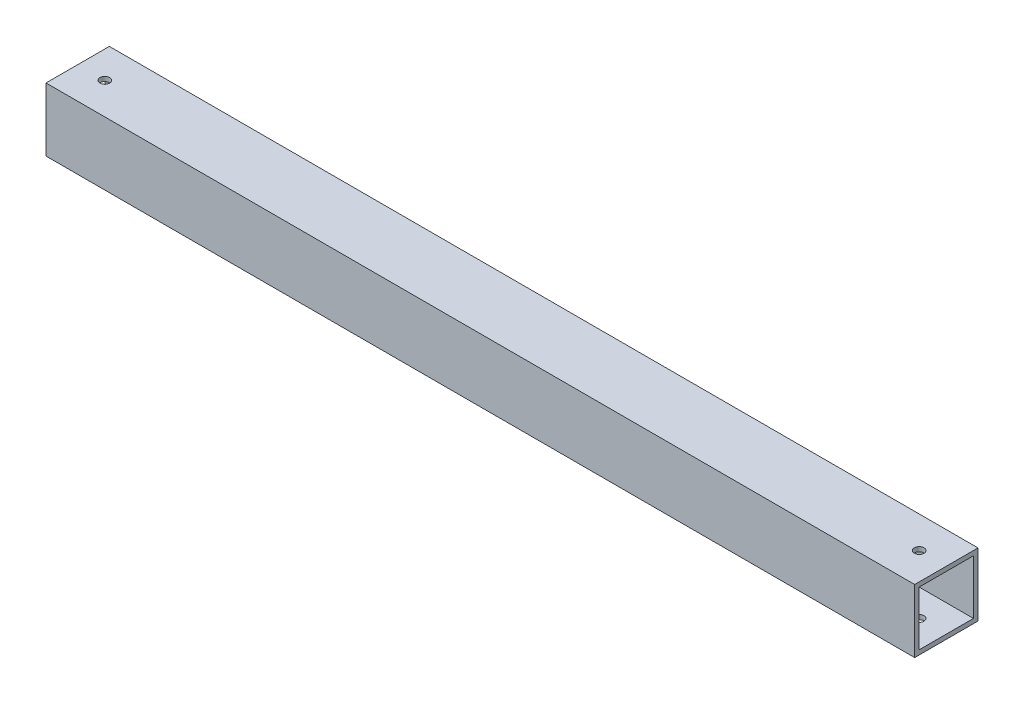
ISO-10303-21;
HEADER;
FILE_DESCRIPTION(('STEP AP214'),'2;1');
FILE_NAME('part.step','',(''),(''),'','','');
FILE_SCHEMA(('AUTOMOTIVE_DESIGN { 1 0 10303 214 1 1 1 1 }'));
ENDSEC;
DATA;
#1=APPLICATION_CONTEXT('core data for automotive mechanical design processes');
#2=APPLICATION_PROTOCOL_DEFINITION('international standard','automotive_design',2000,#1);
#3=PRODUCT_CONTEXT('',#1,'mechanical');
#4=PRODUCT('Part','Part','',(#3));
#5=PRODUCT_RELATED_PRODUCT_CATEGORY('part','',(#4));
#6=PRODUCT_DEFINITION_FORMATION('','',#4);
#7=PRODUCT_DEFINITION_CONTEXT('part definition',#1,'design');
#8=PRODUCT_DEFINITION('design','',#6,#7);
#9=PRODUCT_DEFINITION_SHAPE('','',#8);
#10=(LENGTH_UNIT() NAMED_UNIT(*) SI_UNIT(.MILLI.,.METRE.));
#11=(NAMED_UNIT(*) PLANE_ANGLE_UNIT() SI_UNIT($,.RADIAN.));
#12=(NAMED_UNIT(*) SI_UNIT($,.STERADIAN.) SOLID_ANGLE_UNIT());
#13=UNCERTAINTY_MEASURE_WITH_UNIT(LENGTH_MEASURE(1.E-05),#10,'distance_accuracy_value','');
#14=(GEOMETRIC_REPRESENTATION_CONTEXT(3) GLOBAL_UNCERTAINTY_ASSIGNED_CONTEXT((#13)) GLOBAL_UNIT_ASSIGNED_CONTEXT((#10,
#11,#12)) REPRESENTATION_CONTEXT('',''));
#15=CARTESIAN_POINT('',(0.,0.,0.));
#16=DIRECTION('',(0.,0.,1.));
#17=DIRECTION('',(1.,0.,0.));
#18=AXIS2_PLACEMENT_3D('',#15,#16,#17);
#19=CARTESIAN_POINT('',(609.6,0.,0.));
#20=DIRECTION('',(-1.,0.,0.));
#21=DIRECTION('',(0.,0.,1.));
#22=AXIS2_PLACEMENT_3D('',#19,#20,#21);
#23=PLANE('',#22);
#24=DIRECTION('',(0.,1.,0.));
#25=VECTOR('',#24,1.);
#26=CARTESIAN_POINT('',(609.6,-22.225,-22.225));
#27=LINE('',#26,#25);
#28=CARTESIAN_POINT('',(609.6,-22.225,-22.225));
#29=VERTEX_POINT('',#28);
#30=CARTESIAN_POINT('',(609.6,22.225,-22.225));
#31=VERTEX_POINT('',#30);
#32=EDGE_CURVE('E138',#29,#31,#27,.T.);
#33=ORIENTED_EDGE('',*,*,#32,.T.);
#34=DIRECTION('',(0.,0.,1.));
#35=VECTOR('',#34,1.);
#36=CARTESIAN_POINT('',(609.6,22.225,22.225));
#37=LINE('',#36,#35);
#38=CARTESIAN_POINT('',(609.6,22.225,22.225));
#39=VERTEX_POINT('',#38);
#40=EDGE_CURVE('E141',#31,#39,#37,.T.);
#41=ORIENTED_EDGE('',*,*,#40,.T.);
#42=DIRECTION('',(0.,-1.,0.));
#43=VECTOR('',#42,1.);
#44=CARTESIAN_POINT('',(609.6,-22.225,22.225));
#45=LINE('',#44,#43);
#46=CARTESIAN_POINT('',(609.6,-22.225,22.225));
#47=VERTEX_POINT('',#46);
#48=EDGE_CURVE('E144',#39,#47,#45,.T.);
#49=ORIENTED_EDGE('',*,*,#48,.T.);
#50=DIRECTION('',(0.,0.,-1.));
#51=VECTOR('',#50,1.);
#52=CARTESIAN_POINT('',(609.6,-22.225,22.225));
#53=LINE('',#52,#51);
#54=EDGE_CURVE('E146',#47,#29,#53,.T.);
#55=ORIENTED_EDGE('',*,*,#54,.T.);
#56=EDGE_LOOP('',(#33,#41,#49,#55));
#57=FACE_BOUND('',#56,.T.);
#58=DIRECTION('',(0.,-1.,0.));
#59=VECTOR('',#58,1.);
#60=CARTESIAN_POINT('',(609.6,-19.05,19.05));
#61=LINE('',#60,#59);
#62=CARTESIAN_POINT('',(609.6,19.05,19.05));
#63=VERTEX_POINT('',#62);
#64=CARTESIAN_POINT('',(609.6,-19.05,19.05));
#65=VERTEX_POINT('',#64);
#66=EDGE_CURVE('E100',#63,#65,#61,.T.);
#67=ORIENTED_EDGE('',*,*,#66,.F.);
#68=DIRECTION('',(0.,0.,1.));
#69=VECTOR('',#68,1.);
#70=CARTESIAN_POINT('',(609.6,19.05,19.05));
#71=LINE('',#70,#69);
#72=CARTESIAN_POINT('',(609.6,19.05,-19.05));
#73=VERTEX_POINT('',#72);
#74=EDGE_CURVE('E122',#73,#63,#71,.T.);
#75=ORIENTED_EDGE('',*,*,#74,.F.);
#76=DIRECTION('',(0.,1.,0.));
#77=VECTOR('',#76,1.);
#78=CARTESIAN_POINT('',(609.6,-19.05,-19.05));
#79=LINE('',#78,#77);
#80=CARTESIAN_POINT('',(609.6,-19.05,-19.05));
#81=VERTEX_POINT('',#80);
#82=EDGE_CURVE('E120',#81,#73,#79,.T.);
#83=ORIENTED_EDGE('',*,*,#82,.F.);
#84=DIRECTION('',(0.,0.,-1.));
#85=VECTOR('',#84,1.);
#86=CARTESIAN_POINT('',(609.6,-19.05,19.05));
#87=LINE('',#86,#85);
#88=EDGE_CURVE('E108',#65,#81,#87,.T.);
#89=ORIENTED_EDGE('',*,*,#88,.F.);
#90=EDGE_LOOP('',(#67,#75,#83,#89));
#91=FACE_BOUND('',#90,.T.);
#92=ADVANCED_FACE('F33',(#57,#91),#23,.F.);
#93=CARTESIAN_POINT('',(0.,0.,0.));
#94=DIRECTION('',(-1.,0.,0.));
#95=DIRECTION('',(0.,0.,1.));
#96=AXIS2_PLACEMENT_3D('',#93,#94,#95);
#97=PLANE('',#96);
#98=DIRECTION('',(0.,1.,0.));
#99=VECTOR('',#98,1.);
#100=CARTESIAN_POINT('',(0.,-22.225,-22.225));
#101=LINE('',#100,#99);
#102=CARTESIAN_POINT('',(0.,-22.225,-22.225));
#103=VERTEX_POINT('',#102);
#104=CARTESIAN_POINT('',(0.,22.225,-22.225));
#105=VERTEX_POINT('',#104);
#106=EDGE_CURVE('E116',#103,#105,#101,.T.);
#107=ORIENTED_EDGE('',*,*,#106,.F.);
#108=DIRECTION('',(0.,0.,-1.));
#109=VECTOR('',#108,1.);
#110=CARTESIAN_POINT('',(0.,-22.225,22.225));
#111=LINE('',#110,#109);
#112=CARTESIAN_POINT('',(0.,-22.225,22.225));
#113=VERTEX_POINT('',#112);
#114=EDGE_CURVE('E142',#113,#103,#111,.T.);
#115=ORIENTED_EDGE('',*,*,#114,.F.);
#116=DIRECTION('',(0.,-1.,0.));
#117=VECTOR('',#116,1.);
#118=CARTESIAN_POINT('',(0.,-22.225,22.225));
#119=LINE('',#118,#117);
#120=CARTESIAN_POINT('',(0.,22.225,22.225));
#121=VERTEX_POINT('',#120);
#122=EDGE_CURVE('E153',#121,#113,#119,.T.);
#123=ORIENTED_EDGE('',*,*,#122,.F.);
#124=DIRECTION('',(0.,0.,1.));
#125=VECTOR('',#124,1.);
#126=CARTESIAN_POINT('',(0.,22.225,22.225));
#127=LINE('',#126,#125);
#128=EDGE_CURVE('E151',#105,#121,#127,.T.);
#129=ORIENTED_EDGE('',*,*,#128,.F.);
#130=EDGE_LOOP('',(#107,#115,#123,#129));
#131=FACE_BOUND('',#130,.T.);
#132=DIRECTION('',(0.,0.,1.));
#133=VECTOR('',#132,1.);
#134=CARTESIAN_POINT('',(0.,19.05,19.05));
#135=LINE('',#134,#133);
#136=CARTESIAN_POINT('',(0.,19.05,-19.05));
#137=VERTEX_POINT('',#136);
#138=CARTESIAN_POINT('',(0.,19.05,19.05));
#139=VERTEX_POINT('',#138);
#140=EDGE_CURVE('E109',#137,#139,#135,.T.);
#141=ORIENTED_EDGE('',*,*,#140,.T.);
#142=DIRECTION('',(0.,-1.,0.));
#143=VECTOR('',#142,1.);
#144=CARTESIAN_POINT('',(0.,-19.05,19.05));
#145=LINE('',#144,#143);
#146=CARTESIAN_POINT('',(0.,-19.05,19.05));
#147=VERTEX_POINT('',#146);
#148=EDGE_CURVE('E58',#139,#147,#145,.T.);
#149=ORIENTED_EDGE('',*,*,#148,.T.);
#150=DIRECTION('',(0.,0.,-1.));
#151=VECTOR('',#150,1.);
#152=CARTESIAN_POINT('',(0.,-19.05,19.05));
#153=LINE('',#152,#151);
#154=CARTESIAN_POINT('',(0.,-19.05,-19.05));
#155=VERTEX_POINT('',#154);
#156=EDGE_CURVE('E115',#147,#155,#153,.T.);
#157=ORIENTED_EDGE('',*,*,#156,.T.);
#158=DIRECTION('',(0.,1.,0.));
#159=VECTOR('',#158,1.);
#160=CARTESIAN_POINT('',(0.,-19.05,-19.05));
#161=LINE('',#160,#159);
#162=EDGE_CURVE('E130',#155,#137,#161,.T.);
#163=ORIENTED_EDGE('',*,*,#162,.T.);
#164=EDGE_LOOP('',(#141,#149,#157,#163));
#165=FACE_BOUND('',#164,.T.);
#166=ADVANCED_FACE('F203',(#131,#165),#97,.T.);
#167=CARTESIAN_POINT('',(609.6,-22.225,-22.225));
#168=DIRECTION('',(0.,0.,1.));
#169=DIRECTION('',(1.,0.,0.));
#170=AXIS2_PLACEMENT_3D('',#167,#168,#169);
#171=PLANE('',#170);
#172=ORIENTED_EDGE('',*,*,#106,.T.);
#173=DIRECTION('',(-1.,0.,0.));
#174=VECTOR('',#173,1.);
#175=CARTESIAN_POINT('',(609.6,22.225,-22.225));
#176=LINE('',#175,#174);
#177=EDGE_CURVE('E11',#31,#105,#176,.T.);
#178=ORIENTED_EDGE('',*,*,#177,.F.);
#179=ORIENTED_EDGE('',*,*,#32,.F.);
#180=DIRECTION('',(-1.,0.,0.));
#181=VECTOR('',#180,1.);
#182=CARTESIAN_POINT('',(609.6,-22.225,-22.225));
#183=LINE('',#182,#181);
#184=EDGE_CURVE('E148',#29,#103,#183,.T.);
#185=ORIENTED_EDGE('',*,*,#184,.T.);
#186=EDGE_LOOP('',(#172,#178,#179,#185));
#187=FACE_BOUND('',#186,.T.);
#188=ADVANCED_FACE('F35',(#187),#171,.F.);
#189=CARTESIAN_POINT('',(609.6,22.225,22.225));
#190=DIRECTION('',(0.,-1.,0.));
#191=DIRECTION('',(0.,0.,-1.));
#192=AXIS2_PLACEMENT_3D('',#189,#190,#191);
#193=PLANE('',#192);
#194=CARTESIAN_POINT('',(19.05,22.225,0.));
#195=DIRECTION('',(0.,1.,0.));
#196=DIRECTION('',(0.,0.,1.));
#197=AXIS2_PLACEMENT_3D('',#194,#195,#196);
#198=CIRCLE('',#197,3.37819999999999);
#199=CARTESIAN_POINT('',(19.05,22.225,3.37819999999999));
#200=VERTEX_POINT('',#199);
#201=EDGE_CURVE('E182',#200,#200,#198,.T.);
#202=ORIENTED_EDGE('',*,*,#201,.F.);
#203=EDGE_LOOP('',(#202));
#204=FACE_BOUND('',#203,.T.);
#205=CARTESIAN_POINT('',(590.55,22.225,0.));
#206=DIRECTION('',(0.,1.,0.));
#207=DIRECTION('',(0.,0.,1.));
#208=AXIS2_PLACEMENT_3D('',#205,#206,#207);
#209=CIRCLE('',#208,3.3782);
#210=CARTESIAN_POINT('',(590.55,22.225,3.37819999999993));
#211=VERTEX_POINT('',#210);
#212=EDGE_CURVE('E169',#211,#211,#209,.T.);
#213=ORIENTED_EDGE('',*,*,#212,.F.);
#214=EDGE_LOOP('',(#213));
#215=FACE_BOUND('',#214,.T.);
#216=ORIENTED_EDGE('',*,*,#128,.T.);
#217=DIRECTION('',(-1.,0.,0.));
#218=VECTOR('',#217,1.);
#219=CARTESIAN_POINT('',(609.6,22.225,22.225));
#220=LINE('',#219,#218);
#221=EDGE_CURVE('E42',#39,#121,#220,.T.);
#222=ORIENTED_EDGE('',*,*,#221,.F.);
#223=ORIENTED_EDGE('',*,*,#40,.F.);
#224=ORIENTED_EDGE('',*,*,#177,.T.);
#225=EDGE_LOOP('',(#216,#222,#223,#224));
#226=FACE_BOUND('',#225,.T.);
#227=ADVANCED_FACE('F188',(#204,#215,#226),#193,.F.);
#228=CARTESIAN_POINT('',(609.6,-22.225,22.225));
#229=DIRECTION('',(0.,0.,-1.));
#230=DIRECTION('',(-1.,0.,0.));
#231=AXIS2_PLACEMENT_3D('',#228,#229,#230);
#232=PLANE('',#231);
#233=ORIENTED_EDGE('',*,*,#122,.T.);
#234=DIRECTION('',(-1.,0.,0.));
#235=VECTOR('',#234,1.);
#236=CARTESIAN_POINT('',(609.6,-22.225,22.225));
#237=LINE('',#236,#235);
#238=EDGE_CURVE('E158',#47,#113,#237,.T.);
#239=ORIENTED_EDGE('',*,*,#238,.F.);
#240=ORIENTED_EDGE('',*,*,#48,.F.);
#241=ORIENTED_EDGE('',*,*,#221,.T.);
#242=EDGE_LOOP('',(#233,#239,#240,#241));
#243=FACE_BOUND('',#242,.T.);
#244=ADVANCED_FACE('F191',(#243),#232,.F.);
#245=CARTESIAN_POINT('',(609.6,-22.225,22.225));
#246=DIRECTION('',(0.,1.,0.));
#247=DIRECTION('',(0.,0.,1.));
#248=AXIS2_PLACEMENT_3D('',#245,#246,#247);
#249=PLANE('',#248);
#250=CARTESIAN_POINT('',(19.05,-22.225,0.));
#251=DIRECTION('',(0.,1.,0.));
#252=DIRECTION('',(0.,0.,1.));
#253=AXIS2_PLACEMENT_3D('',#250,#251,#252);
#254=CIRCLE('',#253,3.37819999999999);
#255=CARTESIAN_POINT('',(19.05,-22.225,3.37819999999999));
#256=VERTEX_POINT('',#255);
#257=EDGE_CURVE('E179',#256,#256,#254,.T.);
#258=ORIENTED_EDGE('',*,*,#257,.T.);
#259=EDGE_LOOP('',(#258));
#260=FACE_BOUND('',#259,.T.);
#261=CARTESIAN_POINT('',(590.55,-22.225,0.));
#262=DIRECTION('',(0.,1.,0.));
#263=DIRECTION('',(0.,0.,1.));
#264=AXIS2_PLACEMENT_3D('',#261,#262,#263);
#265=CIRCLE('',#264,3.3782);
#266=CARTESIAN_POINT('',(590.55,-22.225,3.37819999999993));
#267=VERTEX_POINT('',#266);
#268=EDGE_CURVE('E164',#267,#267,#265,.T.);
#269=ORIENTED_EDGE('',*,*,#268,.T.);
#270=EDGE_LOOP('',(#269));
#271=FACE_BOUND('',#270,.T.);
#272=ORIENTED_EDGE('',*,*,#114,.T.);
#273=ORIENTED_EDGE('',*,*,#184,.F.);
#274=ORIENTED_EDGE('',*,*,#54,.F.);
#275=ORIENTED_EDGE('',*,*,#238,.T.);
#276=EDGE_LOOP('',(#272,#273,#274,#275));
#277=FACE_BOUND('',#276,.T.);
#278=ADVANCED_FACE('F207',(#260,#271,#277),#249,.F.);
#279=CARTESIAN_POINT('',(609.6,-19.05,19.05));
#280=DIRECTION('',(0.,0.,-1.));
#281=DIRECTION('',(-1.,0.,0.));
#282=AXIS2_PLACEMENT_3D('',#279,#280,#281);
#283=PLANE('',#282);
#284=ORIENTED_EDGE('',*,*,#148,.F.);
#285=DIRECTION('',(-1.,0.,0.));
#286=VECTOR('',#285,1.);
#287=CARTESIAN_POINT('',(609.6,19.05,19.05));
#288=LINE('',#287,#286);
#289=EDGE_CURVE('E104',#63,#139,#288,.T.);
#290=ORIENTED_EDGE('',*,*,#289,.F.);
#291=ORIENTED_EDGE('',*,*,#66,.T.);
#292=DIRECTION('',(-1.,0.,0.));
#293=VECTOR('',#292,1.);
#294=CARTESIAN_POINT('',(609.6,-19.05,19.05));
#295=LINE('',#294,#293);
#296=EDGE_CURVE('E103',#65,#147,#295,.T.);
#297=ORIENTED_EDGE('',*,*,#296,.T.);
#298=EDGE_LOOP('',(#284,#290,#291,#297));
#299=FACE_BOUND('',#298,.T.);
#300=ADVANCED_FACE('F102',(#299),#283,.T.);
#301=CARTESIAN_POINT('',(609.6,-19.05,19.05));
#302=DIRECTION('',(0.,1.,0.));
#303=DIRECTION('',(0.,0.,1.));
#304=AXIS2_PLACEMENT_3D('',#301,#302,#303);
#305=PLANE('',#304);
#306=CARTESIAN_POINT('',(19.05,-19.05,0.));
#307=DIRECTION('',(0.,1.,0.));
#308=DIRECTION('',(0.,0.,1.));
#309=AXIS2_PLACEMENT_3D('',#306,#307,#308);
#310=CIRCLE('',#309,3.37819999999999);
#311=CARTESIAN_POINT('',(19.05,-19.05,3.37819999999999));
#312=VERTEX_POINT('',#311);
#313=EDGE_CURVE('E174',#312,#312,#310,.T.);
#314=ORIENTED_EDGE('',*,*,#313,.F.);
#315=EDGE_LOOP('',(#314));
#316=FACE_BOUND('',#315,.T.);
#317=CARTESIAN_POINT('',(590.55,-19.05,0.));
#318=DIRECTION('',(0.,1.,0.));
#319=DIRECTION('',(0.,0.,1.));
#320=AXIS2_PLACEMENT_3D('',#317,#318,#319);
#321=CIRCLE('',#320,3.3782);
#322=CARTESIAN_POINT('',(590.55,-19.05,3.37819999999993));
#323=VERTEX_POINT('',#322);
#324=EDGE_CURVE('E162',#323,#323,#321,.T.);
#325=ORIENTED_EDGE('',*,*,#324,.F.);
#326=EDGE_LOOP('',(#325));
#327=FACE_BOUND('',#326,.T.);
#328=ORIENTED_EDGE('',*,*,#156,.F.);
#329=ORIENTED_EDGE('',*,*,#296,.F.);
#330=ORIENTED_EDGE('',*,*,#88,.T.);
#331=DIRECTION('',(-1.,0.,0.));
#332=VECTOR('',#331,1.);
#333=CARTESIAN_POINT('',(609.6,-19.05,-19.05));
#334=LINE('',#333,#332);
#335=EDGE_CURVE('E117',#81,#155,#334,.T.);
#336=ORIENTED_EDGE('',*,*,#335,.T.);
#337=EDGE_LOOP('',(#328,#329,#330,#336));
#338=FACE_BOUND('',#337,.T.);
#339=ADVANCED_FACE('F112',(#316,#327,#338),#305,.T.);
#340=CARTESIAN_POINT('',(609.6,-19.05,-19.05));
#341=DIRECTION('',(0.,0.,1.));
#342=DIRECTION('',(1.,0.,0.));
#343=AXIS2_PLACEMENT_3D('',#340,#341,#342);
#344=PLANE('',#343);
#345=ORIENTED_EDGE('',*,*,#162,.F.);
#346=ORIENTED_EDGE('',*,*,#335,.F.);
#347=ORIENTED_EDGE('',*,*,#82,.T.);
#348=DIRECTION('',(-1.,0.,0.));
#349=VECTOR('',#348,1.);
#350=CARTESIAN_POINT('',(609.6,19.05,-19.05));
#351=LINE('',#350,#349);
#352=EDGE_CURVE('E50',#73,#137,#351,.T.);
#353=ORIENTED_EDGE('',*,*,#352,.T.);
#354=EDGE_LOOP('',(#345,#346,#347,#353));
#355=FACE_BOUND('',#354,.T.);
#356=ADVANCED_FACE('F247',(#355),#344,.T.);
#357=CARTESIAN_POINT('',(609.6,19.05,19.05));
#358=DIRECTION('',(0.,-1.,0.));
#359=DIRECTION('',(0.,0.,-1.));
#360=AXIS2_PLACEMENT_3D('',#357,#358,#359);
#361=PLANE('',#360);
#362=CARTESIAN_POINT('',(19.05,19.05,0.));
#363=DIRECTION('',(0.,-1.,0.));
#364=DIRECTION('',(0.,0.,-1.));
#365=AXIS2_PLACEMENT_3D('',#362,#363,#364);
#366=CIRCLE('',#365,3.37819999999999);
#367=CARTESIAN_POINT('',(19.05,19.05,-3.37819999999999));
#368=VERTEX_POINT('',#367);
#369=EDGE_CURVE('E37',#368,#368,#366,.T.);
#370=ORIENTED_EDGE('',*,*,#369,.F.);
#371=EDGE_LOOP('',(#370));
#372=FACE_BOUND('',#371,.T.);
#373=CARTESIAN_POINT('',(590.55,19.05,0.));
#374=DIRECTION('',(0.,-1.,0.));
#375=DIRECTION('',(0.,0.,-1.));
#376=AXIS2_PLACEMENT_3D('',#373,#374,#375);
#377=CIRCLE('',#376,3.3782);
#378=CARTESIAN_POINT('',(590.55,19.05,-3.37820000000007));
#379=VERTEX_POINT('',#378);
#380=EDGE_CURVE('E128',#379,#379,#377,.T.);
#381=ORIENTED_EDGE('',*,*,#380,.F.);
#382=EDGE_LOOP('',(#381));
#383=FACE_BOUND('',#382,.T.);
#384=ORIENTED_EDGE('',*,*,#140,.F.);
#385=ORIENTED_EDGE('',*,*,#352,.F.);
#386=ORIENTED_EDGE('',*,*,#74,.T.);
#387=ORIENTED_EDGE('',*,*,#289,.T.);
#388=EDGE_LOOP('',(#384,#385,#386,#387));
#389=FACE_BOUND('',#388,.T.);
#390=ADVANCED_FACE('F254',(#372,#383,#389),#361,.T.);
#391=CARTESIAN_POINT('',(590.55,22.225,0.));
#392=DIRECTION('',(0.,1.,0.));
#393=DIRECTION('',(0.,0.,1.));
#394=AXIS2_PLACEMENT_3D('',#391,#392,#393);
#395=CYLINDRICAL_SURFACE('',#394,3.3782);
#396=ORIENTED_EDGE('',*,*,#324,.T.);
#397=EDGE_LOOP('',(#396));
#398=FACE_BOUND('',#397,.T.);
#399=ORIENTED_EDGE('',*,*,#268,.F.);
#400=EDGE_LOOP('',(#399));
#401=FACE_BOUND('',#400,.T.);
#402=ADVANCED_FACE('F261',(#398,#401),#395,.F.);
#403=ORIENTED_EDGE('',*,*,#380,.T.);
#404=EDGE_LOOP('',(#403));
#405=FACE_BOUND('',#404,.T.);
#406=ORIENTED_EDGE('',*,*,#212,.T.);
#407=EDGE_LOOP('',(#406));
#408=FACE_BOUND('',#407,.T.);
#409=ADVANCED_FACE('F269',(#405,#408),#395,.F.);
#410=CARTESIAN_POINT('',(19.05,22.225,0.));
#411=DIRECTION('',(0.,1.,0.));
#412=DIRECTION('',(0.,0.,1.));
#413=AXIS2_PLACEMENT_3D('',#410,#411,#412);
#414=CYLINDRICAL_SURFACE('',#413,3.37819999999999);
#415=ORIENTED_EDGE('',*,*,#369,.T.);
#416=EDGE_LOOP('',(#415));
#417=FACE_BOUND('',#416,.T.);
#418=ORIENTED_EDGE('',*,*,#201,.T.);
#419=EDGE_LOOP('',(#418));
#420=FACE_BOUND('',#419,.T.);
#421=ADVANCED_FACE('F186',(#417,#420),#414,.F.);
#422=ORIENTED_EDGE('',*,*,#313,.T.);
#423=EDGE_LOOP('',(#422));
#424=FACE_BOUND('',#423,.T.);
#425=ORIENTED_EDGE('',*,*,#257,.F.);
#426=EDGE_LOOP('',(#425));
#427=FACE_BOUND('',#426,.T.);
#428=ADVANCED_FACE('F282',(#424,#427),#414,.F.);
#429=CLOSED_SHELL('',(#92,#166,#188,#227,#244,#278,#300,#339,#356,#390,#402,#409,#421,#428));
#430=MANIFOLD_SOLID_BREP('B2',#429);
#431=ADVANCED_BREP_SHAPE_REPRESENTATION('',(#18,#430),#14);
#432=SHAPE_DEFINITION_REPRESENTATION(#9,#431);
ENDSEC;
END-ISO-10303-21;
